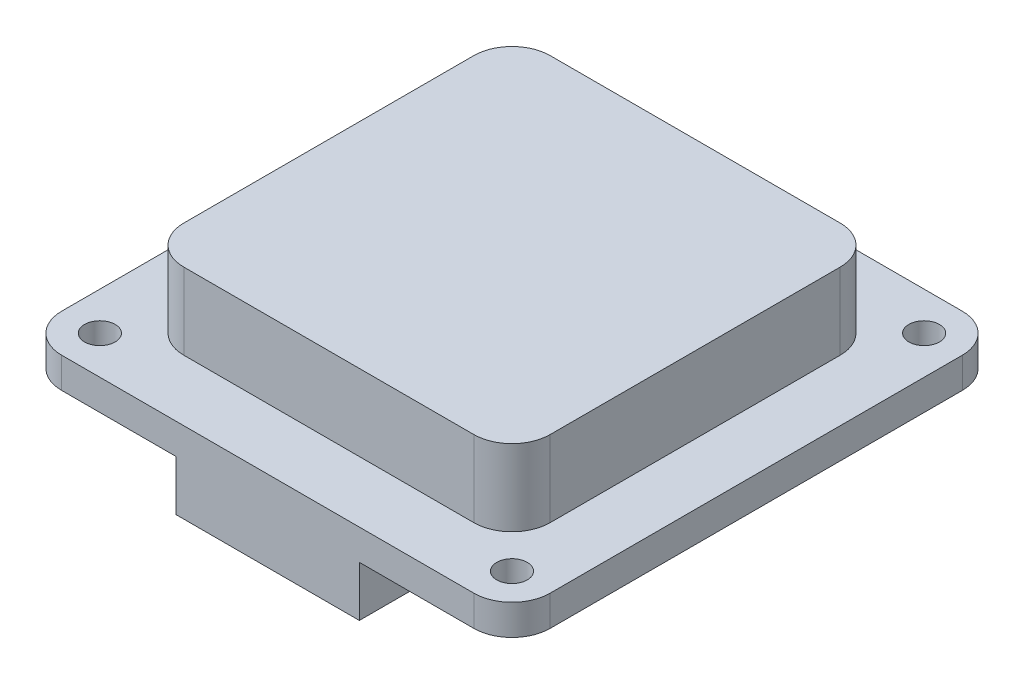
ISO-10303-21;
HEADER;
FILE_DESCRIPTION(('STEP AP214'),'2;1');
FILE_NAME('part.step','',(''),(''),'','','');
FILE_SCHEMA(('AUTOMOTIVE_DESIGN { 1 0 10303 214 1 1 1 1 }'));
ENDSEC;
DATA;
#1=APPLICATION_CONTEXT('core data for automotive mechanical design processes');
#2=APPLICATION_PROTOCOL_DEFINITION('international standard','automotive_design',2000,#1);
#3=PRODUCT_CONTEXT('',#1,'mechanical');
#4=PRODUCT('Part','Part','',(#3));
#5=PRODUCT_RELATED_PRODUCT_CATEGORY('part','',(#4));
#6=PRODUCT_DEFINITION_FORMATION('','',#4);
#7=PRODUCT_DEFINITION_CONTEXT('part definition',#1,'design');
#8=PRODUCT_DEFINITION('design','',#6,#7);
#9=PRODUCT_DEFINITION_SHAPE('','',#8);
#10=(LENGTH_UNIT() NAMED_UNIT(*) SI_UNIT(.MILLI.,.METRE.));
#11=(NAMED_UNIT(*) PLANE_ANGLE_UNIT() SI_UNIT($,.RADIAN.));
#12=(NAMED_UNIT(*) SI_UNIT($,.STERADIAN.) SOLID_ANGLE_UNIT());
#13=UNCERTAINTY_MEASURE_WITH_UNIT(LENGTH_MEASURE(1.E-05),#10,'distance_accuracy_value','');
#14=(GEOMETRIC_REPRESENTATION_CONTEXT(3) GLOBAL_UNCERTAINTY_ASSIGNED_CONTEXT((#13)) GLOBAL_UNIT_ASSIGNED_CONTEXT((#10,
#11,#12)) REPRESENTATION_CONTEXT('',''));
#15=CARTESIAN_POINT('',(0.,0.,0.));
#16=DIRECTION('',(0.,0.,1.));
#17=DIRECTION('',(1.,0.,0.));
#18=AXIS2_PLACEMENT_3D('',#15,#16,#17);
#19=CARTESIAN_POINT('',(13.5,0.,13.5));
#20=DIRECTION('',(0.,-1.,0.));
#21=DIRECTION('',(0.,0.,-1.));
#22=AXIS2_PLACEMENT_3D('',#19,#20,#21);
#23=PLANE('',#22);
#24=DIRECTION('',(-1.,0.,0.));
#25=VECTOR('',#24,1.);
#26=CARTESIAN_POINT('',(-6.,0.,11.));
#27=LINE('',#26,#25);
#28=CARTESIAN_POINT('',(6.,0.,11.));
#29=VERTEX_POINT('',#28);
#30=CARTESIAN_POINT('',(-6.,0.,11.));
#31=VERTEX_POINT('',#30);
#32=EDGE_CURVE('E207',#29,#31,#27,.T.);
#33=ORIENTED_EDGE('',*,*,#32,.F.);
#34=DIRECTION('',(0.,0.,-1.));
#35=VECTOR('',#34,1.);
#36=CARTESIAN_POINT('',(6.,0.,13.5));
#37=LINE('',#36,#35);
#38=CARTESIAN_POINT('',(6.,0.,16.));
#39=VERTEX_POINT('',#38);
#40=EDGE_CURVE('E12',#39,#29,#37,.T.);
#41=ORIENTED_EDGE('',*,*,#40,.F.);
#42=DIRECTION('',(1.,0.,0.));
#43=VECTOR('',#42,1.);
#44=CARTESIAN_POINT('',(-13.5,0.,16.));
#45=LINE('',#44,#43);
#46=CARTESIAN_POINT('',(-6.,0.,16.));
#47=VERTEX_POINT('',#46);
#48=EDGE_CURVE('E353',#47,#39,#45,.T.);
#49=ORIENTED_EDGE('',*,*,#48,.F.);
#50=DIRECTION('',(0.,0.,1.));
#51=VECTOR('',#50,1.);
#52=CARTESIAN_POINT('',(-6.,0.,13.5));
#53=LINE('',#52,#51);
#54=EDGE_CURVE('E382',#31,#47,#53,.T.);
#55=ORIENTED_EDGE('',*,*,#54,.F.);
#56=EDGE_LOOP('',(#33,#41,#49,#55));
#57=FACE_BOUND('',#56,.T.);
#58=ADVANCED_FACE('F39',(#57),#23,.T.);
#59=CARTESIAN_POINT('',(-6.,3.3,-16.));
#60=DIRECTION('',(1.,0.,0.));
#61=DIRECTION('',(0.,0.,-1.));
#62=AXIS2_PLACEMENT_3D('',#59,#60,#61);
#63=PLANE('',#62);
#64=DIRECTION('',(0.,0.,1.));
#65=VECTOR('',#64,1.);
#66=CARTESIAN_POINT('',(-6.,3.3,-16.));
#67=LINE('',#66,#65);
#68=CARTESIAN_POINT('',(-6.,3.30000000000001,11.));
#69=VERTEX_POINT('',#68);
#70=CARTESIAN_POINT('',(-6.,3.3,16.));
#71=VERTEX_POINT('',#70);
#72=EDGE_CURVE('E216',#69,#71,#67,.T.);
#73=ORIENTED_EDGE('',*,*,#72,.F.);
#74=DIRECTION('',(0.,-1.,0.));
#75=VECTOR('',#74,1.);
#76=CARTESIAN_POINT('',(-6.,28.3599281722833,11.));
#77=LINE('',#76,#75);
#78=EDGE_CURVE('E201',#69,#31,#77,.T.);
#79=ORIENTED_EDGE('',*,*,#78,.T.);
#80=ORIENTED_EDGE('',*,*,#54,.T.);
#81=DIRECTION('',(0.,-1.,0.));
#82=VECTOR('',#81,1.);
#83=CARTESIAN_POINT('',(-6.,10.3,16.));
#84=LINE('',#83,#82);
#85=EDGE_CURVE('E224',#71,#47,#84,.T.);
#86=ORIENTED_EDGE('',*,*,#85,.F.);
#87=EDGE_LOOP('',(#73,#79,#80,#86));
#88=FACE_BOUND('',#87,.T.);
#89=ADVANCED_FACE('F222',(#88),#63,.F.);
#90=CARTESIAN_POINT('',(6.,0.,-16.));
#91=DIRECTION('',(-1.,0.,0.));
#92=DIRECTION('',(0.,-1.,0.));
#93=AXIS2_PLACEMENT_3D('',#90,#91,#92);
#94=PLANE('',#93);
#95=ORIENTED_EDGE('',*,*,#40,.T.);
#96=DIRECTION('',(0.,-1.,0.));
#97=VECTOR('',#96,1.);
#98=CARTESIAN_POINT('',(6.,28.3599281722833,11.));
#99=LINE('',#98,#97);
#100=CARTESIAN_POINT('',(6.,3.3,11.));
#101=VERTEX_POINT('',#100);
#102=EDGE_CURVE('E406',#101,#29,#99,.T.);
#103=ORIENTED_EDGE('',*,*,#102,.F.);
#104=DIRECTION('',(0.,0.,1.));
#105=VECTOR('',#104,1.);
#106=CARTESIAN_POINT('',(6.,3.3,-16.));
#107=LINE('',#106,#105);
#108=CARTESIAN_POINT('',(6.,3.3,16.));
#109=VERTEX_POINT('',#108);
#110=EDGE_CURVE('E219',#101,#109,#107,.T.);
#111=ORIENTED_EDGE('',*,*,#110,.T.);
#112=DIRECTION('',(0.,1.,0.));
#113=VECTOR('',#112,1.);
#114=CARTESIAN_POINT('',(6.00000000000003,10.2999999999999,16.));
#115=LINE('',#114,#113);
#116=EDGE_CURVE('E266',#39,#109,#115,.T.);
#117=ORIENTED_EDGE('',*,*,#116,.F.);
#118=EDGE_LOOP('',(#95,#103,#111,#117));
#119=FACE_BOUND('',#118,.T.);
#120=ADVANCED_FACE('F405',(#119),#94,.F.);
#121=CARTESIAN_POINT('',(13.5,10.3,13.5));
#122=DIRECTION('',(0.,-1.,0.));
#123=DIRECTION('',(0.,0.,-1.));
#124=AXIS2_PLACEMENT_3D('',#121,#122,#123);
#125=CYLINDRICAL_SURFACE('',#124,2.5);
#126=DIRECTION('',(0.,-1.,0.));
#127=VECTOR('',#126,1.);
#128=CARTESIAN_POINT('',(13.5,10.3,16.));
#129=LINE('',#128,#127);
#130=CARTESIAN_POINT('',(13.5,5.3,16.));
#131=VERTEX_POINT('',#130);
#132=CARTESIAN_POINT('',(13.5,3.3,16.));
#133=VERTEX_POINT('',#132);
#134=EDGE_CURVE('E356',#131,#133,#129,.T.);
#135=ORIENTED_EDGE('',*,*,#134,.T.);
#136=CARTESIAN_POINT('',(13.5,3.3,13.5));
#137=DIRECTION('',(0.,1.,0.));
#138=DIRECTION('',(0.,0.,1.));
#139=AXIS2_PLACEMENT_3D('',#136,#137,#138);
#140=CIRCLE('',#139,2.5);
#141=CARTESIAN_POINT('',(16.,3.3,13.5));
#142=VERTEX_POINT('',#141);
#143=EDGE_CURVE('E256',#133,#142,#140,.T.);
#144=ORIENTED_EDGE('',*,*,#143,.T.);
#145=DIRECTION('',(0.,-1.,0.));
#146=VECTOR('',#145,1.);
#147=CARTESIAN_POINT('',(16.,10.3,13.5));
#148=LINE('',#147,#146);
#149=CARTESIAN_POINT('',(16.,5.3,13.5));
#150=VERTEX_POINT('',#149);
#151=EDGE_CURVE('E377',#150,#142,#148,.T.);
#152=ORIENTED_EDGE('',*,*,#151,.F.);
#153=CARTESIAN_POINT('',(13.5,5.3,13.5));
#154=DIRECTION('',(0.,1.,0.));
#155=DIRECTION('',(0.,0.,1.));
#156=AXIS2_PLACEMENT_3D('',#153,#154,#155);
#157=CIRCLE('',#156,2.5);
#158=EDGE_CURVE('E348',#131,#150,#157,.T.);
#159=ORIENTED_EDGE('',*,*,#158,.F.);
#160=EDGE_LOOP('',(#135,#144,#152,#159));
#161=FACE_BOUND('',#160,.T.);
#162=ADVANCED_FACE('F41',(#161),#125,.T.);
#163=CARTESIAN_POINT('',(16.,10.3,-13.5));
#164=DIRECTION('',(-1.,0.,0.));
#165=DIRECTION('',(0.,0.,1.));
#166=AXIS2_PLACEMENT_3D('',#163,#164,#165);
#167=PLANE('',#166);
#168=ORIENTED_EDGE('',*,*,#151,.T.);
#169=DIRECTION('',(0.,0.,-1.));
#170=VECTOR('',#169,1.);
#171=CARTESIAN_POINT('',(16.,3.3,-13.5));
#172=LINE('',#171,#170);
#173=CARTESIAN_POINT('',(16.,3.3,-13.5));
#174=VERTEX_POINT('',#173);
#175=EDGE_CURVE('E259',#142,#174,#172,.T.);
#176=ORIENTED_EDGE('',*,*,#175,.T.);
#177=DIRECTION('',(0.,-1.,0.));
#178=VECTOR('',#177,1.);
#179=CARTESIAN_POINT('',(16.,10.3,-13.5));
#180=LINE('',#179,#178);
#181=CARTESIAN_POINT('',(16.,5.3,-13.5));
#182=VERTEX_POINT('',#181);
#183=EDGE_CURVE('E374',#182,#174,#180,.T.);
#184=ORIENTED_EDGE('',*,*,#183,.F.);
#185=DIRECTION('',(0.,0.,-1.));
#186=VECTOR('',#185,1.);
#187=CARTESIAN_POINT('',(16.,5.3,-13.5));
#188=LINE('',#187,#186);
#189=EDGE_CURVE('E346',#150,#182,#188,.T.);
#190=ORIENTED_EDGE('',*,*,#189,.F.);
#191=EDGE_LOOP('',(#168,#176,#184,#190));
#192=FACE_BOUND('',#191,.T.);
#193=ADVANCED_FACE('F418',(#192),#167,.F.);
#194=CARTESIAN_POINT('',(13.5,10.3,-13.5));
#195=DIRECTION('',(0.,-1.,0.));
#196=DIRECTION('',(0.,0.,-1.));
#197=AXIS2_PLACEMENT_3D('',#194,#195,#196);
#198=CYLINDRICAL_SURFACE('',#197,2.5);
#199=ORIENTED_EDGE('',*,*,#183,.T.);
#200=CARTESIAN_POINT('',(13.5,3.3,-13.5));
#201=DIRECTION('',(0.,1.,0.));
#202=DIRECTION('',(0.,0.,1.));
#203=AXIS2_PLACEMENT_3D('',#200,#201,#202);
#204=CIRCLE('',#203,2.5);
#205=CARTESIAN_POINT('',(13.5,3.3,-16.));
#206=VERTEX_POINT('',#205);
#207=EDGE_CURVE('E262',#174,#206,#204,.T.);
#208=ORIENTED_EDGE('',*,*,#207,.T.);
#209=DIRECTION('',(0.,-1.,0.));
#210=VECTOR('',#209,1.);
#211=CARTESIAN_POINT('',(13.5,10.3,-16.));
#212=LINE('',#211,#210);
#213=CARTESIAN_POINT('',(13.5,5.3,-16.));
#214=VERTEX_POINT('',#213);
#215=EDGE_CURVE('E371',#214,#206,#212,.T.);
#216=ORIENTED_EDGE('',*,*,#215,.F.);
#217=CARTESIAN_POINT('',(13.5,5.3,-13.5));
#218=DIRECTION('',(0.,1.,0.));
#219=DIRECTION('',(0.,0.,1.));
#220=AXIS2_PLACEMENT_3D('',#217,#218,#219);
#221=CIRCLE('',#220,2.5);
#222=EDGE_CURVE('E344',#182,#214,#221,.T.);
#223=ORIENTED_EDGE('',*,*,#222,.F.);
#224=EDGE_LOOP('',(#199,#208,#216,#223));
#225=FACE_BOUND('',#224,.T.);
#226=ADVANCED_FACE('F420',(#225),#198,.T.);
#227=CARTESIAN_POINT('',(-13.5,10.3,-16.));
#228=DIRECTION('',(0.,0.,1.));
#229=DIRECTION('',(1.,0.,0.));
#230=AXIS2_PLACEMENT_3D('',#227,#228,#229);
#231=PLANE('',#230);
#232=DIRECTION('',(-1.,0.,0.));
#233=VECTOR('',#232,1.);
#234=CARTESIAN_POINT('',(6.,3.3,-16.));
#235=LINE('',#234,#233);
#236=CARTESIAN_POINT('',(6.,3.3,-16.));
#237=VERTEX_POINT('',#236);
#238=EDGE_CURVE('E447',#206,#237,#235,.T.);
#239=ORIENTED_EDGE('',*,*,#238,.T.);
#240=DIRECTION('',(0.,-1.,0.));
#241=VECTOR('',#240,1.);
#242=CARTESIAN_POINT('',(6.,-0.614628682809168,-16.));
#243=LINE('',#242,#241);
#244=CARTESIAN_POINT('',(6.,0.,-16.));
#245=VERTEX_POINT('',#244);
#246=EDGE_CURVE('E229',#237,#245,#243,.T.);
#247=ORIENTED_EDGE('',*,*,#246,.T.);
#248=DIRECTION('',(-1.,0.,0.));
#249=VECTOR('',#248,1.);
#250=CARTESIAN_POINT('',(-13.5,0.,-16.));
#251=LINE('',#250,#249);
#252=CARTESIAN_POINT('',(-6.,0.,-16.));
#253=VERTEX_POINT('',#252);
#254=EDGE_CURVE('E350',#245,#253,#251,.T.);
#255=ORIENTED_EDGE('',*,*,#254,.T.);
#256=DIRECTION('',(0.,1.,0.));
#257=VECTOR('',#256,1.);
#258=CARTESIAN_POINT('',(-6.,-0.614628682809168,-16.));
#259=LINE('',#258,#257);
#260=CARTESIAN_POINT('',(-6.,3.3,-16.));
#261=VERTEX_POINT('',#260);
#262=EDGE_CURVE('E62',#253,#261,#259,.T.);
#263=ORIENTED_EDGE('',*,*,#262,.T.);
#264=DIRECTION('',(-1.,0.,0.));
#265=VECTOR('',#264,1.);
#266=CARTESIAN_POINT('',(-17.244345890947,3.3,-16.));
#267=LINE('',#266,#265);
#268=CARTESIAN_POINT('',(-13.5,3.3,-16.));
#269=VERTEX_POINT('',#268);
#270=EDGE_CURVE('E227',#261,#269,#267,.T.);
#271=ORIENTED_EDGE('',*,*,#270,.T.);
#272=DIRECTION('',(0.,-1.,0.));
#273=VECTOR('',#272,1.);
#274=CARTESIAN_POINT('',(-13.5,10.3,-16.));
#275=LINE('',#274,#273);
#276=CARTESIAN_POINT('',(-13.5,5.3,-16.));
#277=VERTEX_POINT('',#276);
#278=EDGE_CURVE('E368',#277,#269,#275,.T.);
#279=ORIENTED_EDGE('',*,*,#278,.F.);
#280=DIRECTION('',(-1.,0.,0.));
#281=VECTOR('',#280,1.);
#282=CARTESIAN_POINT('',(-13.5,5.3,-16.));
#283=LINE('',#282,#281);
#284=EDGE_CURVE('E342',#214,#277,#283,.T.);
#285=ORIENTED_EDGE('',*,*,#284,.F.);
#286=ORIENTED_EDGE('',*,*,#215,.T.);
#287=EDGE_LOOP('',(#239,#247,#255,#263,#271,#279,#285,#286));
#288=FACE_BOUND('',#287,.T.);
#289=ADVANCED_FACE('F427',(#288),#231,.F.);
#290=CARTESIAN_POINT('',(-13.5,10.3,-13.5));
#291=DIRECTION('',(0.,-1.,0.));
#292=DIRECTION('',(0.,0.,-1.));
#293=AXIS2_PLACEMENT_3D('',#290,#291,#292);
#294=CYLINDRICAL_SURFACE('',#293,2.5);
#295=ORIENTED_EDGE('',*,*,#278,.T.);
#296=CARTESIAN_POINT('',(-13.5,3.3,-13.5));
#297=DIRECTION('',(0.,1.,0.));
#298=DIRECTION('',(0.,0.,1.));
#299=AXIS2_PLACEMENT_3D('',#296,#297,#298);
#300=CIRCLE('',#299,2.5);
#301=CARTESIAN_POINT('',(-16.,3.3,-13.5));
#302=VERTEX_POINT('',#301);
#303=EDGE_CURVE('E246',#269,#302,#300,.T.);
#304=ORIENTED_EDGE('',*,*,#303,.T.);
#305=DIRECTION('',(0.,-1.,0.));
#306=VECTOR('',#305,1.);
#307=CARTESIAN_POINT('',(-16.,10.3,-13.5));
#308=LINE('',#307,#306);
#309=CARTESIAN_POINT('',(-16.,5.3,-13.5));
#310=VERTEX_POINT('',#309);
#311=EDGE_CURVE('E365',#310,#302,#308,.T.);
#312=ORIENTED_EDGE('',*,*,#311,.F.);
#313=CARTESIAN_POINT('',(-13.5,5.3,-13.5));
#314=DIRECTION('',(0.,1.,0.));
#315=DIRECTION('',(0.,0.,1.));
#316=AXIS2_PLACEMENT_3D('',#313,#314,#315);
#317=CIRCLE('',#316,2.5);
#318=EDGE_CURVE('E340',#277,#310,#317,.T.);
#319=ORIENTED_EDGE('',*,*,#318,.F.);
#320=EDGE_LOOP('',(#295,#304,#312,#319));
#321=FACE_BOUND('',#320,.T.);
#322=ADVANCED_FACE('F430',(#321),#294,.T.);
#323=CARTESIAN_POINT('',(-16.,10.3,-13.5));
#324=DIRECTION('',(1.,0.,0.));
#325=DIRECTION('',(0.,0.,-1.));
#326=AXIS2_PLACEMENT_3D('',#323,#324,#325);
#327=PLANE('',#326);
#328=ORIENTED_EDGE('',*,*,#311,.T.);
#329=DIRECTION('',(0.,0.,1.));
#330=VECTOR('',#329,1.);
#331=CARTESIAN_POINT('',(-16.,3.3,-13.5));
#332=LINE('',#331,#330);
#333=CARTESIAN_POINT('',(-16.,3.3,13.5));
#334=VERTEX_POINT('',#333);
#335=EDGE_CURVE('E243',#302,#334,#332,.T.);
#336=ORIENTED_EDGE('',*,*,#335,.T.);
#337=DIRECTION('',(0.,-1.,0.));
#338=VECTOR('',#337,1.);
#339=CARTESIAN_POINT('',(-16.,10.3,13.5));
#340=LINE('',#339,#338);
#341=CARTESIAN_POINT('',(-16.,5.3,13.5));
#342=VERTEX_POINT('',#341);
#343=EDGE_CURVE('E362',#342,#334,#340,.T.);
#344=ORIENTED_EDGE('',*,*,#343,.F.);
#345=DIRECTION('',(0.,0.,1.));
#346=VECTOR('',#345,1.);
#347=CARTESIAN_POINT('',(-16.,5.3,-13.5));
#348=LINE('',#347,#346);
#349=EDGE_CURVE('E338',#310,#342,#348,.T.);
#350=ORIENTED_EDGE('',*,*,#349,.F.);
#351=EDGE_LOOP('',(#328,#336,#344,#350));
#352=FACE_BOUND('',#351,.T.);
#353=ADVANCED_FACE('F436',(#352),#327,.F.);
#354=CARTESIAN_POINT('',(-13.5,10.3,13.5));
#355=DIRECTION('',(0.,-1.,0.));
#356=DIRECTION('',(0.,0.,-1.));
#357=AXIS2_PLACEMENT_3D('',#354,#355,#356);
#358=CYLINDRICAL_SURFACE('',#357,2.5);
#359=ORIENTED_EDGE('',*,*,#343,.T.);
#360=CARTESIAN_POINT('',(-13.5,3.3,13.5));
#361=DIRECTION('',(0.,1.,0.));
#362=DIRECTION('',(0.,0.,1.));
#363=AXIS2_PLACEMENT_3D('',#360,#361,#362);
#364=CIRCLE('',#363,2.5);
#365=CARTESIAN_POINT('',(-13.5,3.3,16.));
#366=VERTEX_POINT('',#365);
#367=EDGE_CURVE('E240',#334,#366,#364,.T.);
#368=ORIENTED_EDGE('',*,*,#367,.T.);
#369=DIRECTION('',(0.,-1.,0.));
#370=VECTOR('',#369,1.);
#371=CARTESIAN_POINT('',(-13.5,10.3,16.));
#372=LINE('',#371,#370);
#373=CARTESIAN_POINT('',(-13.5,5.3,16.));
#374=VERTEX_POINT('',#373);
#375=EDGE_CURVE('E359',#374,#366,#372,.T.);
#376=ORIENTED_EDGE('',*,*,#375,.F.);
#377=CARTESIAN_POINT('',(-13.5,5.3,13.5));
#378=DIRECTION('',(0.,1.,0.));
#379=DIRECTION('',(0.,0.,1.));
#380=AXIS2_PLACEMENT_3D('',#377,#378,#379);
#381=CIRCLE('',#380,2.5);
#382=EDGE_CURVE('E322',#342,#374,#381,.T.);
#383=ORIENTED_EDGE('',*,*,#382,.F.);
#384=EDGE_LOOP('',(#359,#368,#376,#383));
#385=FACE_BOUND('',#384,.T.);
#386=ADVANCED_FACE('F438',(#385),#358,.T.);
#387=CARTESIAN_POINT('',(-13.5,10.3,16.));
#388=DIRECTION('',(0.,0.,-1.));
#389=DIRECTION('',(-1.,0.,0.));
#390=AXIS2_PLACEMENT_3D('',#387,#388,#389);
#391=PLANE('',#390);
#392=ORIENTED_EDGE('',*,*,#48,.T.);
#393=ORIENTED_EDGE('',*,*,#116,.T.);
#394=DIRECTION('',(1.,0.,0.));
#395=VECTOR('',#394,1.);
#396=CARTESIAN_POINT('',(-13.5,3.3,16.));
#397=LINE('',#396,#395);
#398=EDGE_CURVE('E253',#109,#133,#397,.T.);
#399=ORIENTED_EDGE('',*,*,#398,.T.);
#400=ORIENTED_EDGE('',*,*,#134,.F.);
#401=DIRECTION('',(1.,0.,0.));
#402=VECTOR('',#401,1.);
#403=CARTESIAN_POINT('',(-13.5,5.3,16.));
#404=LINE('',#403,#402);
#405=EDGE_CURVE('E380',#374,#131,#404,.T.);
#406=ORIENTED_EDGE('',*,*,#405,.F.);
#407=ORIENTED_EDGE('',*,*,#375,.T.);
#408=DIRECTION('',(1.,0.,0.));
#409=VECTOR('',#408,1.);
#410=CARTESIAN_POINT('',(-13.5,3.3,16.));
#411=LINE('',#410,#409);
#412=EDGE_CURVE('E237',#366,#71,#411,.T.);
#413=ORIENTED_EDGE('',*,*,#412,.T.);
#414=ORIENTED_EDGE('',*,*,#85,.T.);
#415=EDGE_LOOP('',(#392,#393,#399,#400,#406,#407,#413,#414));
#416=FACE_BOUND('',#415,.T.);
#417=ADVANCED_FACE('F402',(#416),#391,.F.);
#418=DIRECTION('',(1.,0.,0.));
#419=VECTOR('',#418,1.);
#420=CARTESIAN_POINT('',(-6.,0.,-11.));
#421=LINE('',#420,#419);
#422=CARTESIAN_POINT('',(-6.,0.,-11.));
#423=VERTEX_POINT('',#422);
#424=CARTESIAN_POINT('',(6.,0.,-11.));
#425=VERTEX_POINT('',#424);
#426=EDGE_CURVE('E220',#423,#425,#421,.T.);
#427=ORIENTED_EDGE('',*,*,#426,.F.);
#428=EDGE_CURVE('E397',#253,#423,#53,.T.);
#429=ORIENTED_EDGE('',*,*,#428,.F.);
#430=ORIENTED_EDGE('',*,*,#254,.F.);
#431=EDGE_CURVE('E47',#425,#245,#37,.T.);
#432=ORIENTED_EDGE('',*,*,#431,.F.);
#433=EDGE_LOOP('',(#427,#429,#430,#432));
#434=FACE_BOUND('',#433,.T.);
#435=ADVANCED_FACE('F462',(#434),#23,.T.);
#436=CARTESIAN_POINT('',(0.,5.3,0.));
#437=DIRECTION('',(0.,1.,0.));
#438=DIRECTION('',(0.,0.,1.));
#439=AXIS2_PLACEMENT_3D('',#436,#437,#438);
#440=PLANE('',#439);
#441=CARTESIAN_POINT('',(-13.5,5.3,13.5));
#442=DIRECTION('',(0.,1.,0.));
#443=DIRECTION('',(0.,0.,1.));
#444=AXIS2_PLACEMENT_3D('',#441,#442,#443);
#445=CIRCLE('',#444,0.999999999999999);
#446=CARTESIAN_POINT('',(-13.5,5.3,14.5));
#447=VERTEX_POINT('',#446);
#448=EDGE_CURVE('E300',#447,#447,#445,.T.);
#449=ORIENTED_EDGE('',*,*,#448,.F.);
#450=EDGE_LOOP('',(#449));
#451=FACE_BOUND('',#450,.T.);
#452=CARTESIAN_POINT('',(13.5,5.3,-13.5));
#453=DIRECTION('',(0.,1.,0.));
#454=DIRECTION('',(0.,0.,1.));
#455=AXIS2_PLACEMENT_3D('',#452,#453,#454);
#456=CIRCLE('',#455,0.999999999999999);
#457=CARTESIAN_POINT('',(13.5,5.3,-12.5));
#458=VERTEX_POINT('',#457);
#459=EDGE_CURVE('E388',#458,#458,#456,.T.);
#460=ORIENTED_EDGE('',*,*,#459,.F.);
#461=EDGE_LOOP('',(#460));
#462=FACE_BOUND('',#461,.T.);
#463=CARTESIAN_POINT('',(13.5,5.3,13.5));
#464=DIRECTION('',(0.,1.,0.));
#465=DIRECTION('',(0.,0.,1.));
#466=AXIS2_PLACEMENT_3D('',#463,#464,#465);
#467=CIRCLE('',#466,0.999999999999999);
#468=CARTESIAN_POINT('',(13.5,5.3,14.5));
#469=VERTEX_POINT('',#468);
#470=EDGE_CURVE('E385',#469,#469,#467,.T.);
#471=ORIENTED_EDGE('',*,*,#470,.F.);
#472=EDGE_LOOP('',(#471));
#473=FACE_BOUND('',#472,.T.);
#474=CARTESIAN_POINT('',(-13.5,5.3,-13.5));
#475=DIRECTION('',(0.,1.,0.));
#476=DIRECTION('',(0.,0.,1.));
#477=AXIS2_PLACEMENT_3D('',#474,#475,#476);
#478=CIRCLE('',#477,0.999999999999999);
#479=CARTESIAN_POINT('',(-13.5,5.3,-12.5));
#480=VERTEX_POINT('',#479);
#481=EDGE_CURVE('E269',#480,#480,#478,.T.);
#482=ORIENTED_EDGE('',*,*,#481,.F.);
#483=EDGE_LOOP('',(#482));
#484=FACE_BOUND('',#483,.T.);
#485=DIRECTION('',(0.,0.,-1.));
#486=VECTOR('',#485,1.);
#487=CARTESIAN_POINT('',(12.,5.3,9.5));
#488=LINE('',#487,#486);
#489=CARTESIAN_POINT('',(12.,5.3,9.5));
#490=VERTEX_POINT('',#489);
#491=CARTESIAN_POINT('',(12.,5.3,-9.5));
#492=VERTEX_POINT('',#491);
#493=EDGE_CURVE('E292',#490,#492,#488,.T.);
#494=ORIENTED_EDGE('',*,*,#493,.F.);
#495=CARTESIAN_POINT('',(9.50000000000001,5.3,9.5));
#496=DIRECTION('',(0.,1.,0.));
#497=DIRECTION('',(0.,0.,-1.));
#498=AXIS2_PLACEMENT_3D('',#495,#496,#497);
#499=CIRCLE('',#498,2.5);
#500=CARTESIAN_POINT('',(9.50000000000001,5.3,12.));
#501=VERTEX_POINT('',#500);
#502=EDGE_CURVE('E289',#501,#490,#499,.T.);
#503=ORIENTED_EDGE('',*,*,#502,.F.);
#504=DIRECTION('',(1.,0.,0.));
#505=VECTOR('',#504,1.);
#506=CARTESIAN_POINT('',(-9.50000000000001,5.3,12.));
#507=LINE('',#506,#505);
#508=CARTESIAN_POINT('',(-9.50000000000001,5.3,12.));
#509=VERTEX_POINT('',#508);
#510=EDGE_CURVE('E286',#509,#501,#507,.T.);
#511=ORIENTED_EDGE('',*,*,#510,.F.);
#512=CARTESIAN_POINT('',(-9.50000000000001,5.3,9.5));
#513=DIRECTION('',(0.,1.,0.));
#514=DIRECTION('',(0.,0.,1.));
#515=AXIS2_PLACEMENT_3D('',#512,#513,#514);
#516=CIRCLE('',#515,2.5);
#517=CARTESIAN_POINT('',(-12.,5.3,9.5));
#518=VERTEX_POINT('',#517);
#519=EDGE_CURVE('E283',#518,#509,#516,.T.);
#520=ORIENTED_EDGE('',*,*,#519,.F.);
#521=DIRECTION('',(0.,0.,1.));
#522=VECTOR('',#521,1.);
#523=CARTESIAN_POINT('',(-12.,5.3,9.5));
#524=LINE('',#523,#522);
#525=CARTESIAN_POINT('',(-12.,5.3,-9.5));
#526=VERTEX_POINT('',#525);
#527=EDGE_CURVE('E280',#526,#518,#524,.T.);
#528=ORIENTED_EDGE('',*,*,#527,.F.);
#529=CARTESIAN_POINT('',(-9.50000000000001,5.3,-9.5));
#530=DIRECTION('',(0.,1.,0.));
#531=DIRECTION('',(0.,0.,1.));
#532=AXIS2_PLACEMENT_3D('',#529,#530,#531);
#533=CIRCLE('',#532,2.5);
#534=CARTESIAN_POINT('',(-9.50000000000001,5.3,-12.));
#535=VERTEX_POINT('',#534);
#536=EDGE_CURVE('E277',#535,#526,#533,.T.);
#537=ORIENTED_EDGE('',*,*,#536,.F.);
#538=DIRECTION('',(-1.,0.,0.));
#539=VECTOR('',#538,1.);
#540=CARTESIAN_POINT('',(-9.50000000000001,5.3,-12.));
#541=LINE('',#540,#539);
#542=CARTESIAN_POINT('',(9.50000000000001,5.3,-12.));
#543=VERTEX_POINT('',#542);
#544=EDGE_CURVE('E273',#543,#535,#541,.T.);
#545=ORIENTED_EDGE('',*,*,#544,.F.);
#546=CARTESIAN_POINT('',(9.50000000000001,5.3,-9.5));
#547=DIRECTION('',(0.,1.,0.));
#548=DIRECTION('',(0.,0.,1.));
#549=AXIS2_PLACEMENT_3D('',#546,#547,#548);
#550=CIRCLE('',#549,2.5);
#551=EDGE_CURVE('E270',#492,#543,#550,.T.);
#552=ORIENTED_EDGE('',*,*,#551,.F.);
#553=EDGE_LOOP('',(#494,#503,#511,#520,#528,#537,#545,#552));
#554=FACE_BOUND('',#553,.T.);
#555=ORIENTED_EDGE('',*,*,#158,.T.);
#556=ORIENTED_EDGE('',*,*,#189,.T.);
#557=ORIENTED_EDGE('',*,*,#222,.T.);
#558=ORIENTED_EDGE('',*,*,#284,.T.);
#559=ORIENTED_EDGE('',*,*,#318,.T.);
#560=ORIENTED_EDGE('',*,*,#349,.T.);
#561=ORIENTED_EDGE('',*,*,#382,.T.);
#562=ORIENTED_EDGE('',*,*,#405,.T.);
#563=EDGE_LOOP('',(#555,#556,#557,#558,#559,#560,#561,#562));
#564=FACE_BOUND('',#563,.T.);
#565=ADVANCED_FACE('F414',(#451,#462,#473,#484,#554,#564),#440,.T.);
#566=CARTESIAN_POINT('',(9.50000000000001,5.3,-9.5));
#567=DIRECTION('',(0.,1.,0.));
#568=DIRECTION('',(0.,0.,1.));
#569=AXIS2_PLACEMENT_3D('',#566,#567,#568);
#570=CYLINDRICAL_SURFACE('',#569,2.5);
#571=CARTESIAN_POINT('',(9.50000000000001,10.3,-9.5));
#572=DIRECTION('',(0.,1.,0.));
#573=DIRECTION('',(0.,0.,1.));
#574=AXIS2_PLACEMENT_3D('',#571,#572,#573);
#575=CIRCLE('',#574,2.5);
#576=CARTESIAN_POINT('',(12.,10.3,-9.5));
#577=VERTEX_POINT('',#576);
#578=CARTESIAN_POINT('',(9.50000000000001,10.3,-12.));
#579=VERTEX_POINT('',#578);
#580=EDGE_CURVE('E296',#577,#579,#575,.T.);
#581=ORIENTED_EDGE('',*,*,#580,.F.);
#582=DIRECTION('',(0.,1.,0.));
#583=VECTOR('',#582,1.);
#584=CARTESIAN_POINT('',(12.,5.3,-9.5));
#585=LINE('',#584,#583);
#586=EDGE_CURVE('E320',#492,#577,#585,.T.);
#587=ORIENTED_EDGE('',*,*,#586,.F.);
#588=ORIENTED_EDGE('',*,*,#551,.T.);
#589=DIRECTION('',(0.,1.,0.));
#590=VECTOR('',#589,1.);
#591=CARTESIAN_POINT('',(9.50000000000001,5.3,-12.));
#592=LINE('',#591,#590);
#593=EDGE_CURVE('E295',#543,#579,#592,.T.);
#594=ORIENTED_EDGE('',*,*,#593,.T.);
#595=EDGE_LOOP('',(#581,#587,#588,#594));
#596=FACE_BOUND('',#595,.T.);
#597=ADVANCED_FACE('F469',(#596),#570,.T.);
#598=CARTESIAN_POINT('',(12.,5.3,9.5));
#599=DIRECTION('',(1.,0.,0.));
#600=DIRECTION('',(0.,0.,-1.));
#601=AXIS2_PLACEMENT_3D('',#598,#599,#600);
#602=PLANE('',#601);
#603=DIRECTION('',(0.,0.,-1.));
#604=VECTOR('',#603,1.);
#605=CARTESIAN_POINT('',(12.,10.3,9.5));
#606=LINE('',#605,#604);
#607=CARTESIAN_POINT('',(12.,10.3,9.5));
#608=VERTEX_POINT('',#607);
#609=EDGE_CURVE('E274',#608,#577,#606,.T.);
#610=ORIENTED_EDGE('',*,*,#609,.F.);
#611=DIRECTION('',(0.,1.,0.));
#612=VECTOR('',#611,1.);
#613=CARTESIAN_POINT('',(12.,5.3,9.5));
#614=LINE('',#613,#612);
#615=EDGE_CURVE('E323',#490,#608,#614,.T.);
#616=ORIENTED_EDGE('',*,*,#615,.F.);
#617=ORIENTED_EDGE('',*,*,#493,.T.);
#618=ORIENTED_EDGE('',*,*,#586,.T.);
#619=EDGE_LOOP('',(#610,#616,#617,#618));
#620=FACE_BOUND('',#619,.T.);
#621=ADVANCED_FACE('F508',(#620),#602,.T.);
#622=CARTESIAN_POINT('',(9.50000000000001,5.3,9.5));
#623=DIRECTION('',(0.,1.,0.));
#624=DIRECTION('',(0.,0.,1.));
#625=AXIS2_PLACEMENT_3D('',#622,#623,#624);
#626=CYLINDRICAL_SURFACE('',#625,2.5);
#627=CARTESIAN_POINT('',(9.50000000000001,10.3,9.5));
#628=DIRECTION('',(0.,1.,0.));
#629=DIRECTION('',(0.,0.,-1.));
#630=AXIS2_PLACEMENT_3D('',#627,#628,#629);
#631=CIRCLE('',#630,2.5);
#632=CARTESIAN_POINT('',(9.50000000000001,10.3,12.));
#633=VERTEX_POINT('',#632);
#634=EDGE_CURVE('E315',#633,#608,#631,.T.);
#635=ORIENTED_EDGE('',*,*,#634,.F.);
#636=DIRECTION('',(0.,1.,0.));
#637=VECTOR('',#636,1.);
#638=CARTESIAN_POINT('',(9.50000000000001,5.3,12.));
#639=LINE('',#638,#637);
#640=EDGE_CURVE('E325',#501,#633,#639,.T.);
#641=ORIENTED_EDGE('',*,*,#640,.F.);
#642=ORIENTED_EDGE('',*,*,#502,.T.);
#643=ORIENTED_EDGE('',*,*,#615,.T.);
#644=EDGE_LOOP('',(#635,#641,#642,#643));
#645=FACE_BOUND('',#644,.T.);
#646=ADVANCED_FACE('F511',(#645),#626,.T.);
#647=CARTESIAN_POINT('',(-9.50000000000001,5.3,12.));
#648=DIRECTION('',(0.,0.,1.));
#649=DIRECTION('',(1.,0.,0.));
#650=AXIS2_PLACEMENT_3D('',#647,#648,#649);
#651=PLANE('',#650);
#652=DIRECTION('',(1.,0.,0.));
#653=VECTOR('',#652,1.);
#654=CARTESIAN_POINT('',(-9.50000000000001,10.3,12.));
#655=LINE('',#654,#653);
#656=CARTESIAN_POINT('',(-9.50000000000001,10.3,12.));
#657=VERTEX_POINT('',#656);
#658=EDGE_CURVE('E312',#657,#633,#655,.T.);
#659=ORIENTED_EDGE('',*,*,#658,.F.);
#660=DIRECTION('',(0.,1.,0.));
#661=VECTOR('',#660,1.);
#662=CARTESIAN_POINT('',(-9.50000000000001,5.3,12.));
#663=LINE('',#662,#661);
#664=EDGE_CURVE('E327',#509,#657,#663,.T.);
#665=ORIENTED_EDGE('',*,*,#664,.F.);
#666=ORIENTED_EDGE('',*,*,#510,.T.);
#667=ORIENTED_EDGE('',*,*,#640,.T.);
#668=EDGE_LOOP('',(#659,#665,#666,#667));
#669=FACE_BOUND('',#668,.T.);
#670=ADVANCED_FACE('F515',(#669),#651,.T.);
#671=CARTESIAN_POINT('',(-9.50000000000001,5.3,9.5));
#672=DIRECTION('',(0.,1.,0.));
#673=DIRECTION('',(0.,0.,1.));
#674=AXIS2_PLACEMENT_3D('',#671,#672,#673);
#675=CYLINDRICAL_SURFACE('',#674,2.5);
#676=CARTESIAN_POINT('',(-9.50000000000001,10.3,9.5));
#677=DIRECTION('',(0.,1.,0.));
#678=DIRECTION('',(0.,0.,1.));
#679=AXIS2_PLACEMENT_3D('',#676,#677,#678);
#680=CIRCLE('',#679,2.5);
#681=CARTESIAN_POINT('',(-12.,10.3,9.5));
#682=VERTEX_POINT('',#681);
#683=EDGE_CURVE('E309',#682,#657,#680,.T.);
#684=ORIENTED_EDGE('',*,*,#683,.F.);
#685=DIRECTION('',(0.,1.,0.));
#686=VECTOR('',#685,1.);
#687=CARTESIAN_POINT('',(-12.,5.3,9.5));
#688=LINE('',#687,#686);
#689=EDGE_CURVE('E329',#518,#682,#688,.T.);
#690=ORIENTED_EDGE('',*,*,#689,.F.);
#691=ORIENTED_EDGE('',*,*,#519,.T.);
#692=ORIENTED_EDGE('',*,*,#664,.T.);
#693=EDGE_LOOP('',(#684,#690,#691,#692));
#694=FACE_BOUND('',#693,.T.);
#695=ADVANCED_FACE('F519',(#694),#675,.T.);
#696=CARTESIAN_POINT('',(-12.,5.3,9.5));
#697=DIRECTION('',(-1.,0.,0.));
#698=DIRECTION('',(0.,0.,1.));
#699=AXIS2_PLACEMENT_3D('',#696,#697,#698);
#700=PLANE('',#699);
#701=DIRECTION('',(0.,0.,1.));
#702=VECTOR('',#701,1.);
#703=CARTESIAN_POINT('',(-12.,10.3,9.5));
#704=LINE('',#703,#702);
#705=CARTESIAN_POINT('',(-12.,10.3,-9.5));
#706=VERTEX_POINT('',#705);
#707=EDGE_CURVE('E306',#706,#682,#704,.T.);
#708=ORIENTED_EDGE('',*,*,#707,.F.);
#709=DIRECTION('',(0.,1.,0.));
#710=VECTOR('',#709,1.);
#711=CARTESIAN_POINT('',(-12.,5.3,-9.5));
#712=LINE('',#711,#710);
#713=EDGE_CURVE('E331',#526,#706,#712,.T.);
#714=ORIENTED_EDGE('',*,*,#713,.F.);
#715=ORIENTED_EDGE('',*,*,#527,.T.);
#716=ORIENTED_EDGE('',*,*,#689,.T.);
#717=EDGE_LOOP('',(#708,#714,#715,#716));
#718=FACE_BOUND('',#717,.T.);
#719=ADVANCED_FACE('F523',(#718),#700,.T.);
#720=CARTESIAN_POINT('',(-9.50000000000001,5.3,-9.5));
#721=DIRECTION('',(0.,1.,0.));
#722=DIRECTION('',(0.,0.,1.));
#723=AXIS2_PLACEMENT_3D('',#720,#721,#722);
#724=CYLINDRICAL_SURFACE('',#723,2.5);
#725=CARTESIAN_POINT('',(-9.50000000000001,10.3,-9.5));
#726=DIRECTION('',(0.,1.,0.));
#727=DIRECTION('',(0.,0.,1.));
#728=AXIS2_PLACEMENT_3D('',#725,#726,#727);
#729=CIRCLE('',#728,2.5);
#730=CARTESIAN_POINT('',(-9.50000000000001,10.3,-12.));
#731=VERTEX_POINT('',#730);
#732=EDGE_CURVE('E303',#731,#706,#729,.T.);
#733=ORIENTED_EDGE('',*,*,#732,.F.);
#734=DIRECTION('',(0.,1.,0.));
#735=VECTOR('',#734,1.);
#736=CARTESIAN_POINT('',(-9.50000000000001,5.3,-12.));
#737=LINE('',#736,#735);
#738=EDGE_CURVE('E333',#535,#731,#737,.T.);
#739=ORIENTED_EDGE('',*,*,#738,.F.);
#740=ORIENTED_EDGE('',*,*,#536,.T.);
#741=ORIENTED_EDGE('',*,*,#713,.T.);
#742=EDGE_LOOP('',(#733,#739,#740,#741));
#743=FACE_BOUND('',#742,.T.);
#744=ADVANCED_FACE('F527',(#743),#724,.T.);
#745=CARTESIAN_POINT('',(-9.50000000000001,5.3,-12.));
#746=DIRECTION('',(0.,0.,-1.));
#747=DIRECTION('',(-1.,0.,0.));
#748=AXIS2_PLACEMENT_3D('',#745,#746,#747);
#749=PLANE('',#748);
#750=DIRECTION('',(-1.,0.,0.));
#751=VECTOR('',#750,1.);
#752=CARTESIAN_POINT('',(-9.50000000000001,10.3,-12.));
#753=LINE('',#752,#751);
#754=EDGE_CURVE('E299',#579,#731,#753,.T.);
#755=ORIENTED_EDGE('',*,*,#754,.F.);
#756=ORIENTED_EDGE('',*,*,#593,.F.);
#757=ORIENTED_EDGE('',*,*,#544,.T.);
#758=ORIENTED_EDGE('',*,*,#738,.T.);
#759=EDGE_LOOP('',(#755,#756,#757,#758));
#760=FACE_BOUND('',#759,.T.);
#761=ADVANCED_FACE('F531',(#760),#749,.T.);
#762=CARTESIAN_POINT('',(13.5,10.3,13.5));
#763=DIRECTION('',(0.,-1.,0.));
#764=DIRECTION('',(0.,0.,-1.));
#765=AXIS2_PLACEMENT_3D('',#762,#763,#764);
#766=PLANE('',#765);
#767=ORIENTED_EDGE('',*,*,#580,.T.);
#768=ORIENTED_EDGE('',*,*,#754,.T.);
#769=ORIENTED_EDGE('',*,*,#732,.T.);
#770=ORIENTED_EDGE('',*,*,#707,.T.);
#771=ORIENTED_EDGE('',*,*,#683,.T.);
#772=ORIENTED_EDGE('',*,*,#658,.T.);
#773=ORIENTED_EDGE('',*,*,#634,.T.);
#774=ORIENTED_EDGE('',*,*,#609,.T.);
#775=EDGE_LOOP('',(#767,#768,#769,#770,#771,#772,#773,#774));
#776=FACE_BOUND('',#775,.T.);
#777=ADVANCED_FACE('F506',(#776),#766,.F.);
#778=CARTESIAN_POINT('',(-13.5,0.,-13.5));
#779=DIRECTION('',(0.,1.,0.));
#780=DIRECTION('',(0.,0.,1.));
#781=AXIS2_PLACEMENT_3D('',#778,#779,#780);
#782=CYLINDRICAL_SURFACE('',#781,0.999999999999999);
#783=CARTESIAN_POINT('',(-13.5,3.3,-13.5));
#784=DIRECTION('',(0.,1.,0.));
#785=DIRECTION('',(0.,0.,1.));
#786=AXIS2_PLACEMENT_3D('',#783,#784,#785);
#787=CIRCLE('',#786,0.999999999999999);
#788=CARTESIAN_POINT('',(-13.5,3.3,-12.5));
#789=VERTEX_POINT('',#788);
#790=EDGE_CURVE('E234',#789,#789,#787,.F.);
#791=ORIENTED_EDGE('',*,*,#790,.T.);
#792=EDGE_LOOP('',(#791));
#793=FACE_BOUND('',#792,.T.);
#794=ORIENTED_EDGE('',*,*,#481,.T.);
#795=EDGE_LOOP('',(#794));
#796=FACE_BOUND('',#795,.T.);
#797=ADVANCED_FACE('F503',(#793,#796),#782,.F.);
#798=CARTESIAN_POINT('',(13.5,0.,13.5));
#799=DIRECTION('',(0.,1.,0.));
#800=DIRECTION('',(0.,0.,1.));
#801=AXIS2_PLACEMENT_3D('',#798,#799,#800);
#802=CYLINDRICAL_SURFACE('',#801,0.999999999999999);
#803=CARTESIAN_POINT('',(13.5,3.3,13.5));
#804=DIRECTION('',(0.,1.,0.));
#805=DIRECTION('',(0.,0.,1.));
#806=AXIS2_PLACEMENT_3D('',#803,#804,#805);
#807=CIRCLE('',#806,0.999999999999999);
#808=CARTESIAN_POINT('',(13.5,3.3,14.5));
#809=VERTEX_POINT('',#808);
#810=EDGE_CURVE('E250',#809,#809,#807,.F.);
#811=ORIENTED_EDGE('',*,*,#810,.T.);
#812=EDGE_LOOP('',(#811));
#813=FACE_BOUND('',#812,.T.);
#814=ORIENTED_EDGE('',*,*,#470,.T.);
#815=EDGE_LOOP('',(#814));
#816=FACE_BOUND('',#815,.T.);
#817=ADVANCED_FACE('F498',(#813,#816),#802,.F.);
#818=CARTESIAN_POINT('',(13.5,0.,-13.5));
#819=DIRECTION('',(0.,1.,0.));
#820=DIRECTION('',(0.,0.,1.));
#821=AXIS2_PLACEMENT_3D('',#818,#819,#820);
#822=CYLINDRICAL_SURFACE('',#821,0.999999999999999);
#823=CARTESIAN_POINT('',(13.5,3.3,-13.5));
#824=DIRECTION('',(0.,1.,0.));
#825=DIRECTION('',(0.,0.,1.));
#826=AXIS2_PLACEMENT_3D('',#823,#824,#825);
#827=CIRCLE('',#826,0.999999999999999);
#828=CARTESIAN_POINT('',(13.5,3.3,-12.5));
#829=VERTEX_POINT('',#828);
#830=EDGE_CURVE('E249',#829,#829,#827,.F.);
#831=ORIENTED_EDGE('',*,*,#830,.T.);
#832=EDGE_LOOP('',(#831));
#833=FACE_BOUND('',#832,.T.);
#834=ORIENTED_EDGE('',*,*,#459,.T.);
#835=EDGE_LOOP('',(#834));
#836=FACE_BOUND('',#835,.T.);
#837=ADVANCED_FACE('F492',(#833,#836),#822,.F.);
#838=CARTESIAN_POINT('',(-13.5,0.,13.5));
#839=DIRECTION('',(0.,1.,0.));
#840=DIRECTION('',(0.,0.,1.));
#841=AXIS2_PLACEMENT_3D('',#838,#839,#840);
#842=CYLINDRICAL_SURFACE('',#841,0.999999999999999);
#843=CARTESIAN_POINT('',(-13.5,3.3,13.5));
#844=DIRECTION('',(0.,1.,0.));
#845=DIRECTION('',(0.,0.,1.));
#846=AXIS2_PLACEMENT_3D('',#843,#844,#845);
#847=CIRCLE('',#846,0.999999999999999);
#848=CARTESIAN_POINT('',(-13.5,3.3,14.5));
#849=VERTEX_POINT('',#848);
#850=EDGE_CURVE('E238',#849,#849,#847,.F.);
#851=ORIENTED_EDGE('',*,*,#850,.T.);
#852=EDGE_LOOP('',(#851));
#853=FACE_BOUND('',#852,.T.);
#854=ORIENTED_EDGE('',*,*,#448,.T.);
#855=EDGE_LOOP('',(#854));
#856=FACE_BOUND('',#855,.T.);
#857=ADVANCED_FACE('F487',(#853,#856),#842,.F.);
#858=ORIENTED_EDGE('',*,*,#428,.T.);
#859=DIRECTION('',(0.,-1.,0.));
#860=VECTOR('',#859,1.);
#861=CARTESIAN_POINT('',(-6.,28.3599281722833,-11.));
#862=LINE('',#861,#860);
#863=CARTESIAN_POINT('',(-6.,3.3,-11.));
#864=VERTEX_POINT('',#863);
#865=EDGE_CURVE('E211',#864,#423,#862,.T.);
#866=ORIENTED_EDGE('',*,*,#865,.F.);
#867=EDGE_CURVE('E226',#261,#864,#67,.T.);
#868=ORIENTED_EDGE('',*,*,#867,.F.);
#869=ORIENTED_EDGE('',*,*,#262,.F.);
#870=EDGE_LOOP('',(#858,#866,#868,#869));
#871=FACE_BOUND('',#870,.T.);
#872=ADVANCED_FACE('F479',(#871),#63,.F.);
#873=CARTESIAN_POINT('',(6.,3.3,-11.));
#874=VERTEX_POINT('',#873);
#875=EDGE_CURVE('E395',#237,#874,#107,.T.);
#876=ORIENTED_EDGE('',*,*,#875,.T.);
#877=DIRECTION('',(0.,-1.,0.));
#878=VECTOR('',#877,1.);
#879=CARTESIAN_POINT('',(6.,28.3599281722833,-11.));
#880=LINE('',#879,#878);
#881=EDGE_CURVE('E442',#874,#425,#880,.T.);
#882=ORIENTED_EDGE('',*,*,#881,.T.);
#883=ORIENTED_EDGE('',*,*,#431,.T.);
#884=ORIENTED_EDGE('',*,*,#246,.F.);
#885=EDGE_LOOP('',(#876,#882,#883,#884));
#886=FACE_BOUND('',#885,.T.);
#887=ADVANCED_FACE('F461',(#886),#94,.F.);
#888=CARTESIAN_POINT('',(6.,3.3,-16.));
#889=DIRECTION('',(0.,1.,0.));
#890=DIRECTION('',(0.,0.,1.));
#891=AXIS2_PLACEMENT_3D('',#888,#889,#890);
#892=PLANE('',#891);
#893=ORIENTED_EDGE('',*,*,#830,.F.);
#894=EDGE_LOOP('',(#893));
#895=FACE_BOUND('',#894,.T.);
#896=ORIENTED_EDGE('',*,*,#810,.F.);
#897=EDGE_LOOP('',(#896));
#898=FACE_BOUND('',#897,.T.);
#899=ORIENTED_EDGE('',*,*,#175,.F.);
#900=ORIENTED_EDGE('',*,*,#143,.F.);
#901=ORIENTED_EDGE('',*,*,#398,.F.);
#902=ORIENTED_EDGE('',*,*,#110,.F.);
#903=DIRECTION('',(-1.,0.,0.));
#904=VECTOR('',#903,1.);
#905=CARTESIAN_POINT('',(-6.,3.3,11.));
#906=LINE('',#905,#904);
#907=EDGE_CURVE('E204',#101,#69,#906,.T.);
#908=ORIENTED_EDGE('',*,*,#907,.T.);
#909=ORIENTED_EDGE('',*,*,#72,.T.);
#910=ORIENTED_EDGE('',*,*,#412,.F.);
#911=ORIENTED_EDGE('',*,*,#367,.F.);
#912=ORIENTED_EDGE('',*,*,#335,.F.);
#913=ORIENTED_EDGE('',*,*,#303,.F.);
#914=ORIENTED_EDGE('',*,*,#270,.F.);
#915=ORIENTED_EDGE('',*,*,#867,.T.);
#916=DIRECTION('',(1.,0.,0.));
#917=VECTOR('',#916,1.);
#918=CARTESIAN_POINT('',(-6.,3.3,-11.));
#919=LINE('',#918,#917);
#920=EDGE_CURVE('E54',#864,#874,#919,.T.);
#921=ORIENTED_EDGE('',*,*,#920,.T.);
#922=ORIENTED_EDGE('',*,*,#875,.F.);
#923=ORIENTED_EDGE('',*,*,#238,.F.);
#924=ORIENTED_EDGE('',*,*,#207,.F.);
#925=EDGE_LOOP('',(#899,#900,#901,#902,#908,#909,#910,#911,#912,#913,#914,#915,#921,#922,#923,#924));
#926=FACE_BOUND('',#925,.T.);
#927=ORIENTED_EDGE('',*,*,#850,.F.);
#928=EDGE_LOOP('',(#927));
#929=FACE_BOUND('',#928,.T.);
#930=ORIENTED_EDGE('',*,*,#790,.F.);
#931=EDGE_LOOP('',(#930));
#932=FACE_BOUND('',#931,.T.);
#933=ADVANCED_FACE('F214',(#895,#898,#926,#929,#932),#892,.F.);
#934=CARTESIAN_POINT('',(-6.,28.3599281722833,11.));
#935=DIRECTION('',(0.,0.,1.));
#936=DIRECTION('',(1.,0.,0.));
#937=AXIS2_PLACEMENT_3D('',#934,#935,#936);
#938=PLANE('',#937);
#939=ORIENTED_EDGE('',*,*,#102,.T.);
#940=ORIENTED_EDGE('',*,*,#32,.T.);
#941=ORIENTED_EDGE('',*,*,#78,.F.);
#942=ORIENTED_EDGE('',*,*,#907,.F.);
#943=EDGE_LOOP('',(#939,#940,#941,#942));
#944=FACE_BOUND('',#943,.T.);
#945=ADVANCED_FACE('F203',(#944),#938,.F.);
#946=CARTESIAN_POINT('',(-6.,28.3599281722833,-11.));
#947=DIRECTION('',(0.,0.,-1.));
#948=DIRECTION('',(-1.,0.,0.));
#949=AXIS2_PLACEMENT_3D('',#946,#947,#948);
#950=PLANE('',#949);
#951=ORIENTED_EDGE('',*,*,#865,.T.);
#952=ORIENTED_EDGE('',*,*,#426,.T.);
#953=ORIENTED_EDGE('',*,*,#881,.F.);
#954=ORIENTED_EDGE('',*,*,#920,.F.);
#955=EDGE_LOOP('',(#951,#952,#953,#954));
#956=FACE_BOUND('',#955,.T.);
#957=ADVANCED_FACE('F457',(#956),#950,.F.);
#958=CLOSED_SHELL('',(#58,#89,#120,#162,#193,#226,#289,#322,#353,#386,#417,#435,#565,#597,#621,
#646,#670,#695,#719,#744,#761,#777,#797,#817,#837,#857,#872,#887,#933,#945,#957));
#959=MANIFOLD_SOLID_BREP('B2',#958);
#960=ADVANCED_BREP_SHAPE_REPRESENTATION('',(#18,#959),#14);
#961=SHAPE_DEFINITION_REPRESENTATION(#9,#960);
ENDSEC;
END-ISO-10303-21;
